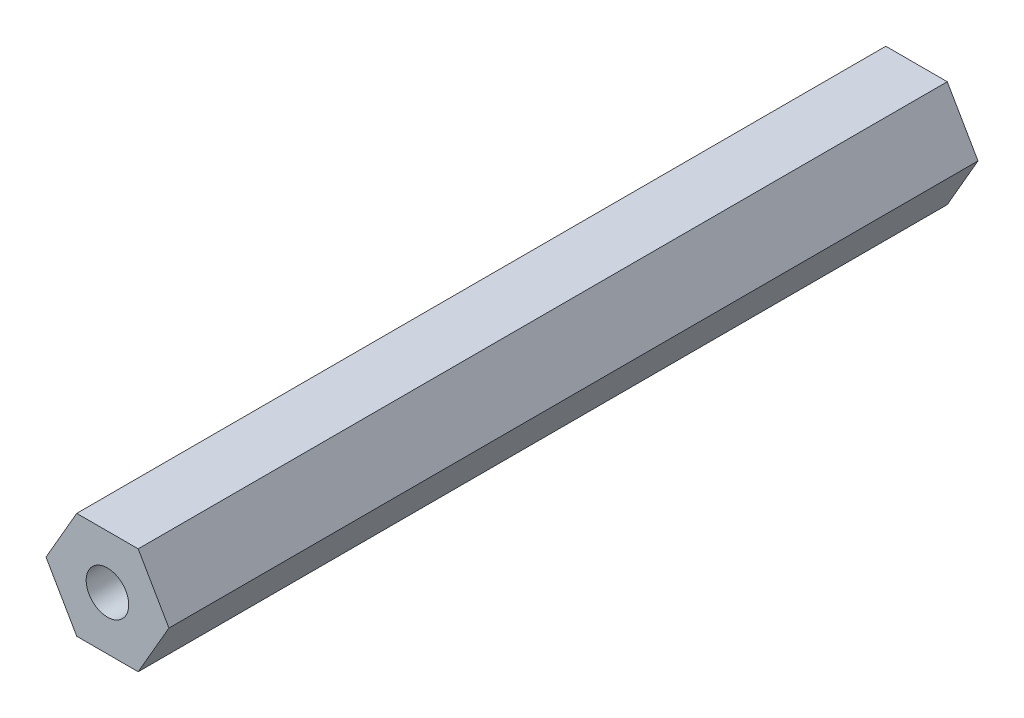
ISO-10303-21;
HEADER;
FILE_DESCRIPTION(('STEP AP214'),'2;1');
FILE_NAME('part.step','',(''),(''),'','','');
FILE_SCHEMA(('AUTOMOTIVE_DESIGN { 1 0 10303 214 1 1 1 1 }'));
ENDSEC;
DATA;
#1=APPLICATION_CONTEXT('core data for automotive mechanical design processes');
#2=APPLICATION_PROTOCOL_DEFINITION('international standard','automotive_design',2000,#1);
#3=PRODUCT_CONTEXT('',#1,'mechanical');
#4=PRODUCT('Part','Part','',(#3));
#5=PRODUCT_RELATED_PRODUCT_CATEGORY('part','',(#4));
#6=PRODUCT_DEFINITION_FORMATION('','',#4);
#7=PRODUCT_DEFINITION_CONTEXT('part definition',#1,'design');
#8=PRODUCT_DEFINITION('design','',#6,#7);
#9=PRODUCT_DEFINITION_SHAPE('','',#8);
#10=(LENGTH_UNIT() NAMED_UNIT(*) SI_UNIT(.MILLI.,.METRE.));
#11=(NAMED_UNIT(*) PLANE_ANGLE_UNIT() SI_UNIT($,.RADIAN.));
#12=(NAMED_UNIT(*) SI_UNIT($,.STERADIAN.) SOLID_ANGLE_UNIT());
#13=UNCERTAINTY_MEASURE_WITH_UNIT(LENGTH_MEASURE(1.E-05),#10,'distance_accuracy_value','');
#14=(GEOMETRIC_REPRESENTATION_CONTEXT(3) GLOBAL_UNCERTAINTY_ASSIGNED_CONTEXT((#13)) GLOBAL_UNIT_ASSIGNED_CONTEXT((#10,
#11,#12)) REPRESENTATION_CONTEXT('',''));
#15=CARTESIAN_POINT('',(0.,0.,0.));
#16=DIRECTION('',(0.,0.,1.));
#17=DIRECTION('',(1.,0.,0.));
#18=AXIS2_PLACEMENT_3D('',#15,#16,#17);
#19=CARTESIAN_POINT('',(1.44337567297409,-2.49999999999997,38.));
#20=DIRECTION('',(-0.866025403784442,0.499999999999995,0.));
#21=DIRECTION('',(-0.499999999999995,-0.866025403784442,0.));
#22=AXIS2_PLACEMENT_3D('',#19,#20,#21);
#23=PLANE('',#22);
#24=DIRECTION('',(0.499999999999995,0.866025403784442,0.));
#25=VECTOR('',#24,1.);
#26=CARTESIAN_POINT('',(1.44337567297409,-2.49999999999997,0.));
#27=LINE('',#26,#25);
#28=CARTESIAN_POINT('',(1.44337567297409,-2.49999999999997,0.));
#29=VERTEX_POINT('',#28);
#30=CARTESIAN_POINT('',(2.88675134594812,0.,0.));
#31=VERTEX_POINT('',#30);
#32=EDGE_CURVE('E118',#29,#31,#27,.T.);
#33=ORIENTED_EDGE('',*,*,#32,.T.);
#34=DIRECTION('',(0.,0.,-1.));
#35=VECTOR('',#34,1.);
#36=CARTESIAN_POINT('',(2.88675134594812,0.,38.));
#37=LINE('',#36,#35);
#38=CARTESIAN_POINT('',(2.88675134594812,0.,38.));
#39=VERTEX_POINT('',#38);
#40=EDGE_CURVE('E11',#39,#31,#37,.T.);
#41=ORIENTED_EDGE('',*,*,#40,.F.);
#42=DIRECTION('',(0.499999999999995,0.866025403784442,0.));
#43=VECTOR('',#42,1.);
#44=CARTESIAN_POINT('',(1.44337567297409,-2.49999999999997,38.));
#45=LINE('',#44,#43);
#46=CARTESIAN_POINT('',(1.44337567297409,-2.49999999999997,38.));
#47=VERTEX_POINT('',#46);
#48=EDGE_CURVE('E129',#47,#39,#45,.T.);
#49=ORIENTED_EDGE('',*,*,#48,.F.);
#50=DIRECTION('',(0.,0.,-1.));
#51=VECTOR('',#50,1.);
#52=CARTESIAN_POINT('',(1.44337567297409,-2.49999999999997,38.));
#53=LINE('',#52,#51);
#54=EDGE_CURVE('E114',#47,#29,#53,.T.);
#55=ORIENTED_EDGE('',*,*,#54,.T.);
#56=EDGE_LOOP('',(#33,#41,#49,#55));
#57=FACE_BOUND('',#56,.T.);
#58=ADVANCED_FACE('F34',(#57),#23,.F.);
#59=CARTESIAN_POINT('',(2.88675134594812,0.,38.));
#60=DIRECTION('',(-0.866025403784438,-0.500000000000001,0.));
#61=DIRECTION('',(0.500000000000001,-0.866025403784438,0.));
#62=AXIS2_PLACEMENT_3D('',#59,#60,#61);
#63=PLANE('',#62);
#64=DIRECTION('',(-0.500000000000001,0.866025403784438,0.));
#65=VECTOR('',#64,1.);
#66=CARTESIAN_POINT('',(2.88675134594812,0.,0.));
#67=LINE('',#66,#65);
#68=CARTESIAN_POINT('',(1.44337567297405,2.49999999999999,0.));
#69=VERTEX_POINT('',#68);
#70=EDGE_CURVE('E121',#31,#69,#67,.T.);
#71=ORIENTED_EDGE('',*,*,#70,.T.);
#72=DIRECTION('',(0.,0.,-1.));
#73=VECTOR('',#72,1.);
#74=CARTESIAN_POINT('',(1.44337567297405,2.49999999999999,38.));
#75=LINE('',#74,#73);
#76=CARTESIAN_POINT('',(1.44337567297405,2.49999999999999,38.));
#77=VERTEX_POINT('',#76);
#78=EDGE_CURVE('E42',#77,#69,#75,.T.);
#79=ORIENTED_EDGE('',*,*,#78,.F.);
#80=DIRECTION('',(-0.500000000000001,0.866025403784438,0.));
#81=VECTOR('',#80,1.);
#82=CARTESIAN_POINT('',(2.88675134594812,0.,38.));
#83=LINE('',#82,#81);
#84=EDGE_CURVE('E87',#39,#77,#83,.T.);
#85=ORIENTED_EDGE('',*,*,#84,.F.);
#86=ORIENTED_EDGE('',*,*,#40,.T.);
#87=EDGE_LOOP('',(#71,#79,#85,#86));
#88=FACE_BOUND('',#87,.T.);
#89=ADVANCED_FACE('F154',(#88),#63,.F.);
#90=CARTESIAN_POINT('',(1.44337567297405,2.49999999999999,38.));
#91=DIRECTION('',(0.,-1.,0.));
#92=DIRECTION('',(1.,0.,0.));
#93=AXIS2_PLACEMENT_3D('',#90,#91,#92);
#94=PLANE('',#93);
#95=DIRECTION('',(-1.,0.,0.));
#96=VECTOR('',#95,1.);
#97=CARTESIAN_POINT('',(1.44337567297405,2.49999999999999,0.));
#98=LINE('',#97,#96);
#99=CARTESIAN_POINT('',(-1.44337567297407,2.49999999999998,0.));
#100=VERTEX_POINT('',#99);
#101=EDGE_CURVE('E124',#69,#100,#98,.T.);
#102=ORIENTED_EDGE('',*,*,#101,.T.);
#103=DIRECTION('',(0.,0.,-1.));
#104=VECTOR('',#103,1.);
#105=CARTESIAN_POINT('',(-1.44337567297407,2.49999999999998,38.));
#106=LINE('',#105,#104);
#107=CARTESIAN_POINT('',(-1.44337567297407,2.49999999999998,38.));
#108=VERTEX_POINT('',#107);
#109=EDGE_CURVE('E109',#108,#100,#106,.T.);
#110=ORIENTED_EDGE('',*,*,#109,.F.);
#111=DIRECTION('',(-1.,0.,0.));
#112=VECTOR('',#111,1.);
#113=CARTESIAN_POINT('',(1.44337567297405,2.49999999999999,38.));
#114=LINE('',#113,#112);
#115=EDGE_CURVE('E100',#77,#108,#114,.T.);
#116=ORIENTED_EDGE('',*,*,#115,.F.);
#117=ORIENTED_EDGE('',*,*,#78,.T.);
#118=EDGE_LOOP('',(#102,#110,#116,#117));
#119=FACE_BOUND('',#118,.T.);
#120=ADVANCED_FACE('F135',(#119),#94,.F.);
#121=CARTESIAN_POINT('',(-1.44337567297407,2.49999999999998,38.));
#122=DIRECTION('',(0.866025403784441,-0.499999999999995,0.));
#123=DIRECTION('',(0.499999999999995,0.866025403784441,0.));
#124=AXIS2_PLACEMENT_3D('',#121,#122,#123);
#125=PLANE('',#124);
#126=DIRECTION('',(-0.499999999999995,-0.866025403784441,0.));
#127=VECTOR('',#126,1.);
#128=CARTESIAN_POINT('',(-1.44337567297407,2.49999999999998,0.));
#129=LINE('',#128,#127);
#130=CARTESIAN_POINT('',(-2.88675134594812,0.,0.));
#131=VERTEX_POINT('',#130);
#132=EDGE_CURVE('E108',#100,#131,#129,.T.);
#133=ORIENTED_EDGE('',*,*,#132,.T.);
#134=DIRECTION('',(0.,0.,-1.));
#135=VECTOR('',#134,1.);
#136=CARTESIAN_POINT('',(-2.88675134594812,0.,38.));
#137=LINE('',#136,#135);
#138=CARTESIAN_POINT('',(-2.88675134594812,0.,38.));
#139=VERTEX_POINT('',#138);
#140=EDGE_CURVE('E105',#139,#131,#137,.T.);
#141=ORIENTED_EDGE('',*,*,#140,.F.);
#142=DIRECTION('',(-0.499999999999995,-0.866025403784441,0.));
#143=VECTOR('',#142,1.);
#144=CARTESIAN_POINT('',(-1.44337567297407,2.49999999999998,38.));
#145=LINE('',#144,#143);
#146=EDGE_CURVE('E94',#108,#139,#145,.T.);
#147=ORIENTED_EDGE('',*,*,#146,.F.);
#148=ORIENTED_EDGE('',*,*,#109,.T.);
#149=EDGE_LOOP('',(#133,#141,#147,#148));
#150=FACE_BOUND('',#149,.T.);
#151=ADVANCED_FACE('F106',(#150),#125,.F.);
#152=CARTESIAN_POINT('',(-2.88675134594812,0.,38.));
#153=DIRECTION('',(0.866025403784435,0.500000000000007,0.));
#154=DIRECTION('',(-0.500000000000007,0.866025403784434,0.));
#155=AXIS2_PLACEMENT_3D('',#152,#153,#154);
#156=PLANE('',#155);
#157=DIRECTION('',(0.500000000000007,-0.866025403784435,0.));
#158=VECTOR('',#157,1.);
#159=CARTESIAN_POINT('',(-2.88675134594812,0.,0.));
#160=LINE('',#159,#158);
#161=CARTESIAN_POINT('',(-1.44337567297404,-2.5,0.));
#162=VERTEX_POINT('',#161);
#163=EDGE_CURVE('E73',#131,#162,#160,.T.);
#164=ORIENTED_EDGE('',*,*,#163,.T.);
#165=DIRECTION('',(0.,0.,-1.));
#166=VECTOR('',#165,1.);
#167=CARTESIAN_POINT('',(-1.44337567297404,-2.5,38.));
#168=LINE('',#167,#166);
#169=CARTESIAN_POINT('',(-1.44337567297404,-2.5,38.));
#170=VERTEX_POINT('',#169);
#171=EDGE_CURVE('E110',#170,#162,#168,.T.);
#172=ORIENTED_EDGE('',*,*,#171,.F.);
#173=DIRECTION('',(0.500000000000007,-0.866025403784435,0.));
#174=VECTOR('',#173,1.);
#175=CARTESIAN_POINT('',(-2.88675134594812,0.,38.));
#176=LINE('',#175,#174);
#177=EDGE_CURVE('E98',#139,#170,#176,.T.);
#178=ORIENTED_EDGE('',*,*,#177,.F.);
#179=ORIENTED_EDGE('',*,*,#140,.T.);
#180=EDGE_LOOP('',(#164,#172,#178,#179));
#181=FACE_BOUND('',#180,.T.);
#182=ADVANCED_FACE('F112',(#181),#156,.F.);
#183=CARTESIAN_POINT('',(-1.44337567297404,-2.5,38.));
#184=DIRECTION('',(0.,1.,0.));
#185=DIRECTION('',(-1.,0.,0.));
#186=AXIS2_PLACEMENT_3D('',#183,#184,#185);
#187=PLANE('',#186);
#188=DIRECTION('',(1.,0.,0.));
#189=VECTOR('',#188,1.);
#190=CARTESIAN_POINT('',(-1.44337567297404,-2.5,0.));
#191=LINE('',#190,#189);
#192=EDGE_CURVE('E79',#162,#29,#191,.T.);
#193=ORIENTED_EDGE('',*,*,#192,.T.);
#194=ORIENTED_EDGE('',*,*,#54,.F.);
#195=DIRECTION('',(1.,0.,0.));
#196=VECTOR('',#195,1.);
#197=CARTESIAN_POINT('',(-1.44337567297404,-2.5,38.));
#198=LINE('',#197,#196);
#199=EDGE_CURVE('E50',#170,#47,#198,.T.);
#200=ORIENTED_EDGE('',*,*,#199,.F.);
#201=ORIENTED_EDGE('',*,*,#171,.T.);
#202=EDGE_LOOP('',(#193,#194,#200,#201));
#203=FACE_BOUND('',#202,.T.);
#204=ADVANCED_FACE('F142',(#203),#187,.F.);
#205=CARTESIAN_POINT('',(0.,0.,38.));
#206=DIRECTION('',(0.,0.,1.));
#207=DIRECTION('',(1.,0.,0.));
#208=AXIS2_PLACEMENT_3D('',#205,#206,#207);
#209=PLANE('',#208);
#210=CARTESIAN_POINT('',(0.,0.,38.));
#211=DIRECTION('',(0.,0.,1.));
#212=DIRECTION('',(1.,0.,0.));
#213=AXIS2_PLACEMENT_3D('',#210,#211,#212);
#214=CIRCLE('',#213,1.);
#215=CARTESIAN_POINT('',(1.,0.,38.));
#216=VERTEX_POINT('',#215);
#217=EDGE_CURVE('E209',#216,#216,#214,.T.);
#218=ORIENTED_EDGE('',*,*,#217,.F.);
#219=EDGE_LOOP('',(#218));
#220=FACE_BOUND('',#219,.T.);
#221=ORIENTED_EDGE('',*,*,#48,.T.);
#222=ORIENTED_EDGE('',*,*,#84,.T.);
#223=ORIENTED_EDGE('',*,*,#115,.T.);
#224=ORIENTED_EDGE('',*,*,#146,.T.);
#225=ORIENTED_EDGE('',*,*,#177,.T.);
#226=ORIENTED_EDGE('',*,*,#199,.T.);
#227=EDGE_LOOP('',(#221,#222,#223,#224,#225,#226));
#228=FACE_BOUND('',#227,.T.);
#229=ADVANCED_FACE('F96',(#220,#228),#209,.T.);
#230=CARTESIAN_POINT('',(0.,0.,0.));
#231=DIRECTION('',(0.,0.,1.));
#232=DIRECTION('',(1.,0.,0.));
#233=AXIS2_PLACEMENT_3D('',#230,#231,#232);
#234=PLANE('',#233);
#235=CARTESIAN_POINT('',(0.,0.,0.));
#236=DIRECTION('',(0.,0.,1.));
#237=DIRECTION('',(1.,0.,0.));
#238=AXIS2_PLACEMENT_3D('',#235,#236,#237);
#239=CIRCLE('',#238,1.);
#240=CARTESIAN_POINT('',(1.,0.,0.));
#241=VERTEX_POINT('',#240);
#242=EDGE_CURVE('E122',#241,#241,#239,.T.);
#243=ORIENTED_EDGE('',*,*,#242,.T.);
#244=EDGE_LOOP('',(#243));
#245=FACE_BOUND('',#244,.T.);
#246=ORIENTED_EDGE('',*,*,#32,.F.);
#247=ORIENTED_EDGE('',*,*,#192,.F.);
#248=ORIENTED_EDGE('',*,*,#163,.F.);
#249=ORIENTED_EDGE('',*,*,#132,.F.);
#250=ORIENTED_EDGE('',*,*,#101,.F.);
#251=ORIENTED_EDGE('',*,*,#70,.F.);
#252=EDGE_LOOP('',(#246,#247,#248,#249,#250,#251));
#253=FACE_BOUND('',#252,.T.);
#254=ADVANCED_FACE('F138',(#245,#253),#234,.F.);
#255=CARTESIAN_POINT('',(0.,0.,0.));
#256=DIRECTION('',(0.,0.,1.));
#257=DIRECTION('',(1.,0.,0.));
#258=AXIS2_PLACEMENT_3D('',#255,#256,#257);
#259=CYLINDRICAL_SURFACE('',#258,1.);
#260=ORIENTED_EDGE('',*,*,#242,.F.);
#261=EDGE_LOOP('',(#260));
#262=FACE_BOUND('',#261,.T.);
#263=ORIENTED_EDGE('',*,*,#217,.T.);
#264=EDGE_LOOP('',(#263));
#265=FACE_BOUND('',#264,.T.);
#266=ADVANCED_FACE('F191',(#262,#265),#259,.F.);
#267=CLOSED_SHELL('',(#58,#89,#120,#151,#182,#204,#229,#254,#266));
#268=MANIFOLD_SOLID_BREP('B2',#267);
#269=ADVANCED_BREP_SHAPE_REPRESENTATION('',(#18,#268),#14);
#270=SHAPE_DEFINITION_REPRESENTATION(#9,#269);
ENDSEC;
END-ISO-10303-21;
